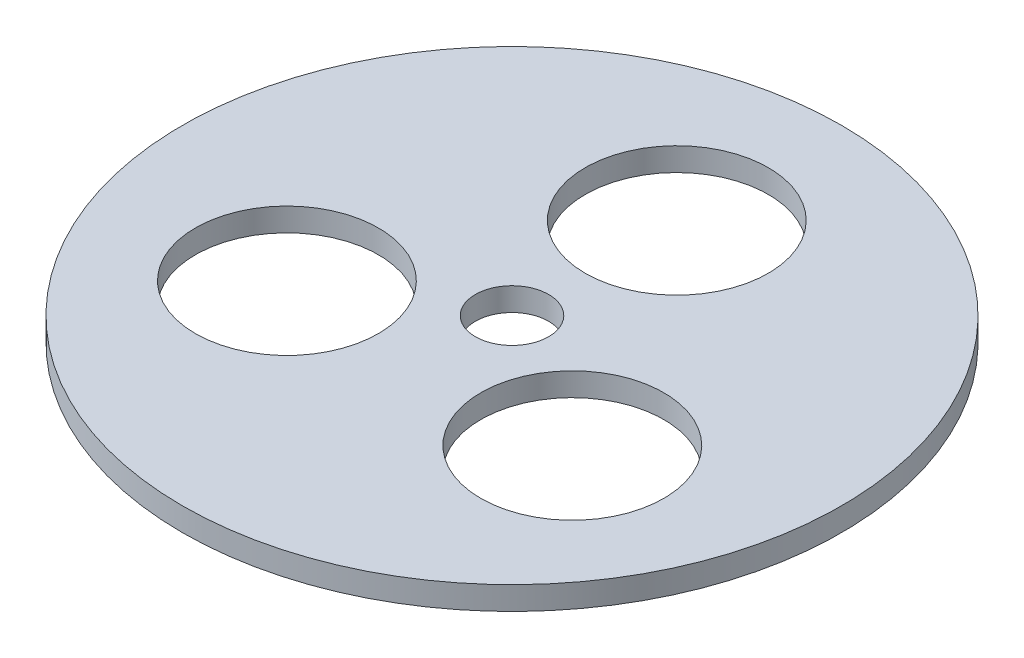
ISO-10303-21;
HEADER;
FILE_DESCRIPTION(('STEP AP214'),'2;1');
FILE_NAME('part.step','',(''),(''),'','','');
FILE_SCHEMA(('AUTOMOTIVE_DESIGN { 1 0 10303 214 1 1 1 1 }'));
ENDSEC;
DATA;
#1=APPLICATION_CONTEXT('core data for automotive mechanical design processes');
#2=APPLICATION_PROTOCOL_DEFINITION('international standard','automotive_design',2000,#1);
#3=PRODUCT_CONTEXT('',#1,'mechanical');
#4=PRODUCT('Part','Part','',(#3));
#5=PRODUCT_RELATED_PRODUCT_CATEGORY('part','',(#4));
#6=PRODUCT_DEFINITION_FORMATION('','',#4);
#7=PRODUCT_DEFINITION_CONTEXT('part definition',#1,'design');
#8=PRODUCT_DEFINITION('design','',#6,#7);
#9=PRODUCT_DEFINITION_SHAPE('','',#8);
#10=(LENGTH_UNIT() NAMED_UNIT(*) SI_UNIT(.MILLI.,.METRE.));
#11=(NAMED_UNIT(*) PLANE_ANGLE_UNIT() SI_UNIT($,.RADIAN.));
#12=(NAMED_UNIT(*) SI_UNIT($,.STERADIAN.) SOLID_ANGLE_UNIT());
#13=UNCERTAINTY_MEASURE_WITH_UNIT(LENGTH_MEASURE(1.E-05),#10,'distance_accuracy_value','');
#14=(GEOMETRIC_REPRESENTATION_CONTEXT(3) GLOBAL_UNCERTAINTY_ASSIGNED_CONTEXT((#13)) GLOBAL_UNIT_ASSIGNED_CONTEXT((#10,
#11,#12)) REPRESENTATION_CONTEXT('',''));
#15=CARTESIAN_POINT('',(0.,0.,0.));
#16=DIRECTION('',(0.,0.,1.));
#17=DIRECTION('',(1.,0.,0.));
#18=AXIS2_PLACEMENT_3D('',#15,#16,#17);
#19=CARTESIAN_POINT('',(0.,3.175,0.));
#20=DIRECTION('',(0.,1.,0.));
#21=DIRECTION('',(0.,0.,1.));
#22=AXIS2_PLACEMENT_3D('',#19,#20,#21);
#23=PLANE('',#22);
#24=CARTESIAN_POINT('',(0.,3.175,0.));
#25=DIRECTION('',(0.,1.,0.));
#26=DIRECTION('',(0.,0.,1.));
#27=AXIS2_PLACEMENT_3D('',#24,#25,#26);
#28=CIRCLE('',#27,5.);
#29=CARTESIAN_POINT('',(0.,3.175,5.));
#30=VERTEX_POINT('',#29);
#31=EDGE_CURVE('E64',#30,#30,#28,.T.);
#32=ORIENTED_EDGE('',*,*,#31,.F.);
#33=EDGE_LOOP('',(#32));
#34=FACE_BOUND('',#33,.T.);
#35=CARTESIAN_POINT('',(19.4855715851498,3.175,11.2500000000001));
#36=DIRECTION('',(0.,1.,0.));
#37=DIRECTION('',(0.,0.,1.));
#38=AXIS2_PLACEMENT_3D('',#35,#36,#37);
#39=CIRCLE('',#38,12.5);
#40=CARTESIAN_POINT('',(19.4855715851498,3.175,23.7500000000001));
#41=VERTEX_POINT('',#40);
#42=EDGE_CURVE('E50',#41,#41,#39,.T.);
#43=ORIENTED_EDGE('',*,*,#42,.F.);
#44=EDGE_LOOP('',(#43));
#45=FACE_BOUND('',#44,.T.);
#46=CARTESIAN_POINT('',(0.,3.175,0.));
#47=DIRECTION('',(0.,1.,0.));
#48=DIRECTION('',(0.,0.,1.));
#49=AXIS2_PLACEMENT_3D('',#46,#47,#48);
#50=CIRCLE('',#49,45.);
#51=CARTESIAN_POINT('',(0.,3.175,45.));
#52=VERTEX_POINT('',#51);
#53=EDGE_CURVE('E10',#52,#52,#50,.T.);
#54=ORIENTED_EDGE('',*,*,#53,.T.);
#55=EDGE_LOOP('',(#54));
#56=FACE_BOUND('',#55,.T.);
#57=CARTESIAN_POINT('',(0.,3.175,-22.5));
#58=DIRECTION('',(0.,1.,0.));
#59=DIRECTION('',(0.,0.,1.));
#60=AXIS2_PLACEMENT_3D('',#57,#58,#59);
#61=CIRCLE('',#60,12.5);
#62=CARTESIAN_POINT('',(0.,3.175,-10.));
#63=VERTEX_POINT('',#62);
#64=EDGE_CURVE('E45',#63,#63,#61,.T.);
#65=ORIENTED_EDGE('',*,*,#64,.F.);
#66=EDGE_LOOP('',(#65));
#67=FACE_BOUND('',#66,.T.);
#68=CARTESIAN_POINT('',(-19.48557158515,3.175,11.2499999999998));
#69=DIRECTION('',(0.,1.,0.));
#70=DIRECTION('',(0.,0.,1.));
#71=AXIS2_PLACEMENT_3D('',#68,#69,#70);
#72=CIRCLE('',#71,12.5);
#73=CARTESIAN_POINT('',(-19.48557158515,3.175,23.7499999999998));
#74=VERTEX_POINT('',#73);
#75=EDGE_CURVE('E56',#74,#74,#72,.T.);
#76=ORIENTED_EDGE('',*,*,#75,.F.);
#77=EDGE_LOOP('',(#76));
#78=FACE_BOUND('',#77,.T.);
#79=ADVANCED_FACE('F32',(#34,#45,#56,#67,#78),#23,.T.);
#80=CARTESIAN_POINT('',(0.,0.,0.));
#81=DIRECTION('',(0.,1.,0.));
#82=DIRECTION('',(0.,0.,1.));
#83=AXIS2_PLACEMENT_3D('',#80,#81,#82);
#84=PLANE('',#83);
#85=CARTESIAN_POINT('',(0.,0.,12.5));
#86=DIRECTION('',(0.,-1.,0.));
#87=DIRECTION('',(0.,0.,-1.));
#88=AXIS2_PLACEMENT_3D('',#85,#86,#87);
#89=CIRCLE('',#88,1.25);
#90=CARTESIAN_POINT('',(0.,0.,11.25));
#91=VERTEX_POINT('',#90);
#92=EDGE_CURVE('E80',#91,#91,#89,.T.);
#93=ORIENTED_EDGE('',*,*,#92,.F.);
#94=EDGE_LOOP('',(#93));
#95=FACE_BOUND('',#94,.T.);
#96=CARTESIAN_POINT('',(10.8253175473054,0.,-6.25000000000021));
#97=DIRECTION('',(0.,-1.,0.));
#98=DIRECTION('',(0.,0.,1.));
#99=AXIS2_PLACEMENT_3D('',#96,#97,#98);
#100=CIRCLE('',#99,1.25);
#101=CARTESIAN_POINT('',(10.8253175473054,0.,-5.00000000000021));
#102=VERTEX_POINT('',#101);
#103=EDGE_CURVE('E74',#102,#102,#100,.T.);
#104=ORIENTED_EDGE('',*,*,#103,.F.);
#105=EDGE_LOOP('',(#104));
#106=FACE_BOUND('',#105,.T.);
#107=CARTESIAN_POINT('',(-10.8253175473055,0.,-6.2499999999999));
#108=DIRECTION('',(0.,-1.,0.));
#109=DIRECTION('',(0.,0.,1.));
#110=AXIS2_PLACEMENT_3D('',#107,#108,#109);
#111=CIRCLE('',#110,1.25);
#112=CARTESIAN_POINT('',(-10.8253175473055,0.,-4.99999999999989));
#113=VERTEX_POINT('',#112);
#114=EDGE_CURVE('E68',#113,#113,#111,.T.);
#115=ORIENTED_EDGE('',*,*,#114,.F.);
#116=EDGE_LOOP('',(#115));
#117=FACE_BOUND('',#116,.T.);
#118=CARTESIAN_POINT('',(0.,0.,0.));
#119=DIRECTION('',(0.,1.,0.));
#120=DIRECTION('',(0.,0.,1.));
#121=AXIS2_PLACEMENT_3D('',#118,#119,#120);
#122=CIRCLE('',#121,5.);
#123=CARTESIAN_POINT('',(0.,0.,5.));
#124=VERTEX_POINT('',#123);
#125=EDGE_CURVE('E36',#124,#124,#122,.T.);
#126=ORIENTED_EDGE('',*,*,#125,.T.);
#127=EDGE_LOOP('',(#126));
#128=FACE_BOUND('',#127,.T.);
#129=CARTESIAN_POINT('',(0.,0.,0.));
#130=DIRECTION('',(0.,1.,0.));
#131=DIRECTION('',(0.,0.,1.));
#132=AXIS2_PLACEMENT_3D('',#129,#130,#131);
#133=CIRCLE('',#132,45.);
#134=CARTESIAN_POINT('',(0.,0.,45.));
#135=VERTEX_POINT('',#134);
#136=EDGE_CURVE('E40',#135,#135,#133,.T.);
#137=ORIENTED_EDGE('',*,*,#136,.F.);
#138=EDGE_LOOP('',(#137));
#139=FACE_BOUND('',#138,.T.);
#140=CARTESIAN_POINT('',(0.,0.,-22.5));
#141=DIRECTION('',(0.,1.,0.));
#142=DIRECTION('',(0.,0.,1.));
#143=AXIS2_PLACEMENT_3D('',#140,#141,#142);
#144=CIRCLE('',#143,12.5);
#145=CARTESIAN_POINT('',(0.,0.,-10.));
#146=VERTEX_POINT('',#145);
#147=EDGE_CURVE('E47',#146,#146,#144,.T.);
#148=ORIENTED_EDGE('',*,*,#147,.T.);
#149=EDGE_LOOP('',(#148));
#150=FACE_BOUND('',#149,.T.);
#151=CARTESIAN_POINT('',(19.4855715851498,0.,11.2500000000001));
#152=DIRECTION('',(0.,1.,0.));
#153=DIRECTION('',(0.,0.,1.));
#154=AXIS2_PLACEMENT_3D('',#151,#152,#153);
#155=CIRCLE('',#154,12.5);
#156=CARTESIAN_POINT('',(19.4855715851498,0.,23.7500000000001));
#157=VERTEX_POINT('',#156);
#158=EDGE_CURVE('E53',#157,#157,#155,.T.);
#159=ORIENTED_EDGE('',*,*,#158,.T.);
#160=EDGE_LOOP('',(#159));
#161=FACE_BOUND('',#160,.T.);
#162=CARTESIAN_POINT('',(-19.48557158515,0.,11.2499999999998));
#163=DIRECTION('',(0.,1.,0.));
#164=DIRECTION('',(0.,0.,1.));
#165=AXIS2_PLACEMENT_3D('',#162,#163,#164);
#166=CIRCLE('',#165,12.5);
#167=CARTESIAN_POINT('',(-19.48557158515,0.,23.7499999999998));
#168=VERTEX_POINT('',#167);
#169=EDGE_CURVE('E59',#168,#168,#166,.T.);
#170=ORIENTED_EDGE('',*,*,#169,.T.);
#171=EDGE_LOOP('',(#170));
#172=FACE_BOUND('',#171,.T.);
#173=ADVANCED_FACE('F95',(#95,#106,#117,#128,#139,#150,#161,#172),#84,.F.);
#174=CARTESIAN_POINT('',(0.,3.175,0.));
#175=DIRECTION('',(0.,-1.,0.));
#176=DIRECTION('',(0.,0.,-1.));
#177=AXIS2_PLACEMENT_3D('',#174,#175,#176);
#178=CYLINDRICAL_SURFACE('',#177,45.);
#179=ORIENTED_EDGE('',*,*,#53,.F.);
#180=EDGE_LOOP('',(#179));
#181=FACE_BOUND('',#180,.T.);
#182=ORIENTED_EDGE('',*,*,#136,.T.);
#183=EDGE_LOOP('',(#182));
#184=FACE_BOUND('',#183,.T.);
#185=ADVANCED_FACE('F34',(#181,#184),#178,.T.);
#186=CARTESIAN_POINT('',(0.,3.175,-22.5));
#187=DIRECTION('',(0.,-1.,0.));
#188=DIRECTION('',(0.,0.,-1.));
#189=AXIS2_PLACEMENT_3D('',#186,#187,#188);
#190=CYLINDRICAL_SURFACE('',#189,12.5);
#191=ORIENTED_EDGE('',*,*,#64,.T.);
#192=EDGE_LOOP('',(#191));
#193=FACE_BOUND('',#192,.T.);
#194=ORIENTED_EDGE('',*,*,#147,.F.);
#195=EDGE_LOOP('',(#194));
#196=FACE_BOUND('',#195,.T.);
#197=ADVANCED_FACE('F126',(#193,#196),#190,.F.);
#198=CARTESIAN_POINT('',(19.4855715851498,3.175,11.2500000000001));
#199=DIRECTION('',(0.,-1.,0.));
#200=DIRECTION('',(0.,0.,-1.));
#201=AXIS2_PLACEMENT_3D('',#198,#199,#200);
#202=CYLINDRICAL_SURFACE('',#201,12.5);
#203=ORIENTED_EDGE('',*,*,#42,.T.);
#204=EDGE_LOOP('',(#203));
#205=FACE_BOUND('',#204,.T.);
#206=ORIENTED_EDGE('',*,*,#158,.F.);
#207=EDGE_LOOP('',(#206));
#208=FACE_BOUND('',#207,.T.);
#209=ADVANCED_FACE('F116',(#205,#208),#202,.F.);
#210=CARTESIAN_POINT('',(-19.48557158515,3.175,11.2499999999998));
#211=DIRECTION('',(0.,-1.,0.));
#212=DIRECTION('',(0.,0.,-1.));
#213=AXIS2_PLACEMENT_3D('',#210,#211,#212);
#214=CYLINDRICAL_SURFACE('',#213,12.5);
#215=ORIENTED_EDGE('',*,*,#75,.T.);
#216=EDGE_LOOP('',(#215));
#217=FACE_BOUND('',#216,.T.);
#218=ORIENTED_EDGE('',*,*,#169,.F.);
#219=EDGE_LOOP('',(#218));
#220=FACE_BOUND('',#219,.T.);
#221=ADVANCED_FACE('F113',(#217,#220),#214,.F.);
#222=CARTESIAN_POINT('',(0.,-3.175,0.));
#223=DIRECTION('',(0.,1.,0.));
#224=DIRECTION('',(0.,0.,1.));
#225=AXIS2_PLACEMENT_3D('',#222,#223,#224);
#226=CYLINDRICAL_SURFACE('',#225,5.);
#227=ORIENTED_EDGE('',*,*,#31,.T.);
#228=EDGE_LOOP('',(#227));
#229=FACE_BOUND('',#228,.T.);
#230=ORIENTED_EDGE('',*,*,#125,.F.);
#231=EDGE_LOOP('',(#230));
#232=FACE_BOUND('',#231,.T.);
#233=ADVANCED_FACE('F115',(#229,#232),#226,.F.);
#234=CARTESIAN_POINT('',(-10.8253175473055,1.,-6.2499999999999));
#235=DIRECTION('',(0.,-1.,0.));
#236=DIRECTION('',(0.,0.,-1.));
#237=AXIS2_PLACEMENT_3D('',#234,#235,#236);
#238=CYLINDRICAL_SURFACE('',#237,1.25);
#239=CARTESIAN_POINT('',(-10.8253175473055,1.,-6.2499999999999));
#240=DIRECTION('',(0.,-1.,0.));
#241=DIRECTION('',(0.,0.,1.));
#242=AXIS2_PLACEMENT_3D('',#239,#240,#241);
#243=CIRCLE('',#242,1.25);
#244=CARTESIAN_POINT('',(-10.8253175473055,1.,-4.99999999999989));
#245=VERTEX_POINT('',#244);
#246=EDGE_CURVE('E71',#245,#245,#243,.T.);
#247=ORIENTED_EDGE('',*,*,#246,.F.);
#248=EDGE_LOOP('',(#247));
#249=FACE_BOUND('',#248,.T.);
#250=ORIENTED_EDGE('',*,*,#114,.T.);
#251=EDGE_LOOP('',(#250));
#252=FACE_BOUND('',#251,.T.);
#253=ADVANCED_FACE('F123',(#249,#252),#238,.F.);
#254=CARTESIAN_POINT('',(-10.8253175473055,1.,-6.2499999999999));
#255=DIRECTION('',(0.,1.,0.));
#256=DIRECTION('',(0.,0.,1.));
#257=AXIS2_PLACEMENT_3D('',#254,#255,#256);
#258=PLANE('',#257);
#259=ORIENTED_EDGE('',*,*,#246,.T.);
#260=EDGE_LOOP('',(#259));
#261=FACE_BOUND('',#260,.T.);
#262=ADVANCED_FACE('F168',(#261),#258,.F.);
#263=CARTESIAN_POINT('',(10.8253175473054,1.,-6.25000000000021));
#264=DIRECTION('',(0.,-1.,0.));
#265=DIRECTION('',(0.,0.,-1.));
#266=AXIS2_PLACEMENT_3D('',#263,#264,#265);
#267=CYLINDRICAL_SURFACE('',#266,1.25);
#268=CARTESIAN_POINT('',(10.8253175473054,1.,-6.25000000000021));
#269=DIRECTION('',(0.,-1.,0.));
#270=DIRECTION('',(0.,0.,1.));
#271=AXIS2_PLACEMENT_3D('',#268,#269,#270);
#272=CIRCLE('',#271,1.25);
#273=CARTESIAN_POINT('',(10.8253175473054,1.,-5.00000000000021));
#274=VERTEX_POINT('',#273);
#275=EDGE_CURVE('E77',#274,#274,#272,.T.);
#276=ORIENTED_EDGE('',*,*,#275,.F.);
#277=EDGE_LOOP('',(#276));
#278=FACE_BOUND('',#277,.T.);
#279=ORIENTED_EDGE('',*,*,#103,.T.);
#280=EDGE_LOOP('',(#279));
#281=FACE_BOUND('',#280,.T.);
#282=ADVANCED_FACE('F178',(#278,#281),#267,.F.);
#283=CARTESIAN_POINT('',(10.8253175473054,1.,-6.25000000000021));
#284=DIRECTION('',(0.,1.,0.));
#285=DIRECTION('',(0.,0.,1.));
#286=AXIS2_PLACEMENT_3D('',#283,#284,#285);
#287=PLANE('',#286);
#288=ORIENTED_EDGE('',*,*,#275,.T.);
#289=EDGE_LOOP('',(#288));
#290=FACE_BOUND('',#289,.T.);
#291=ADVANCED_FACE('F91',(#290),#287,.F.);
#292=CARTESIAN_POINT('',(0.,1.,12.5));
#293=DIRECTION('',(0.,-1.,0.));
#294=DIRECTION('',(0.,0.,-1.));
#295=AXIS2_PLACEMENT_3D('',#292,#293,#294);
#296=CYLINDRICAL_SURFACE('',#295,1.25);
#297=CARTESIAN_POINT('',(0.,1.,12.5));
#298=DIRECTION('',(0.,-1.,0.));
#299=DIRECTION('',(0.,0.,-1.));
#300=AXIS2_PLACEMENT_3D('',#297,#298,#299);
#301=CIRCLE('',#300,1.25);
#302=CARTESIAN_POINT('',(0.,1.,11.25));
#303=VERTEX_POINT('',#302);
#304=EDGE_CURVE('E67',#303,#303,#301,.T.);
#305=ORIENTED_EDGE('',*,*,#304,.F.);
#306=EDGE_LOOP('',(#305));
#307=FACE_BOUND('',#306,.T.);
#308=ORIENTED_EDGE('',*,*,#92,.T.);
#309=EDGE_LOOP('',(#308));
#310=FACE_BOUND('',#309,.T.);
#311=ADVANCED_FACE('F88',(#307,#310),#296,.F.);
#312=CARTESIAN_POINT('',(0.,1.,12.5));
#313=DIRECTION('',(0.,-1.,0.));
#314=DIRECTION('',(0.,0.,-1.));
#315=AXIS2_PLACEMENT_3D('',#312,#313,#314);
#316=PLANE('',#315);
#317=ORIENTED_EDGE('',*,*,#304,.T.);
#318=EDGE_LOOP('',(#317));
#319=FACE_BOUND('',#318,.T.);
#320=ADVANCED_FACE('F86',(#319),#316,.T.);
#321=CLOSED_SHELL('',(#79,#173,#185,#197,#209,#221,#233,#253,#262,#282,#291,#311,#320));
#322=MANIFOLD_SOLID_BREP('B2',#321);
#323=ADVANCED_BREP_SHAPE_REPRESENTATION('',(#18,#322),#14);
#324=SHAPE_DEFINITION_REPRESENTATION(#9,#323);
ENDSEC;
END-ISO-10303-21;
